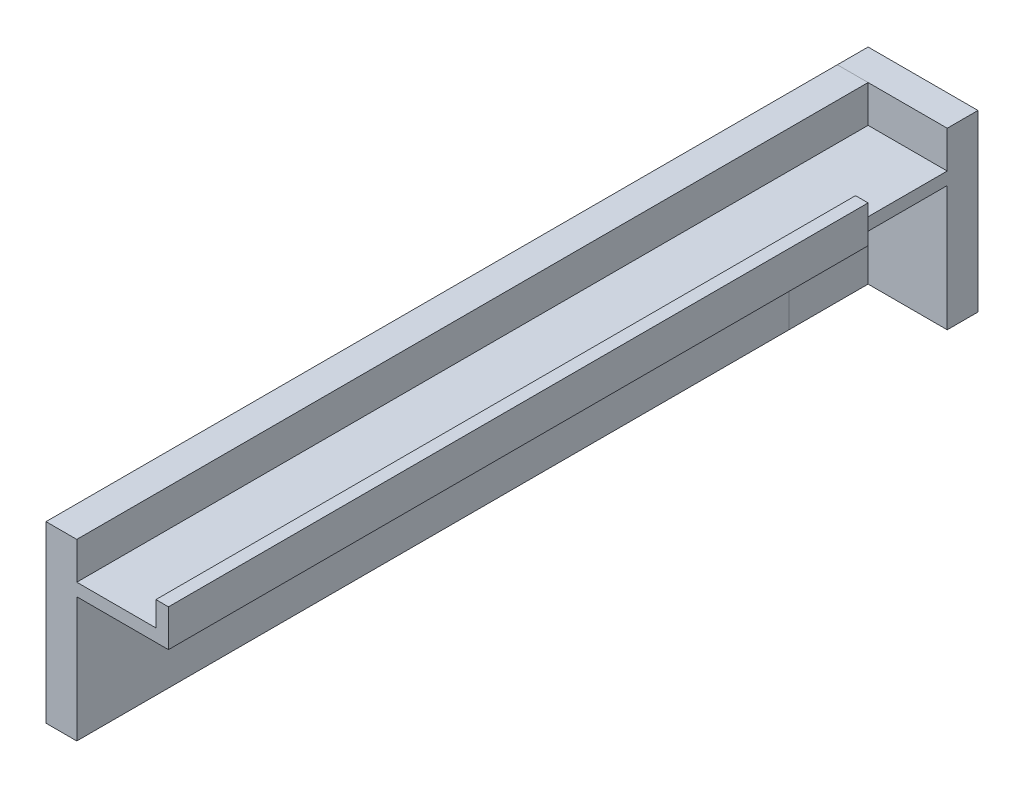
ISO-10303-21;
HEADER;
FILE_DESCRIPTION(('STEP AP214'),'2;1');
FILE_NAME('part.step','',(''),(''),'','','');
FILE_SCHEMA(('AUTOMOTIVE_DESIGN { 1 0 10303 214 1 1 1 1 }'));
ENDSEC;
DATA;
#1=APPLICATION_CONTEXT('core data for automotive mechanical design processes');
#2=APPLICATION_PROTOCOL_DEFINITION('international standard','automotive_design',2000,#1);
#3=PRODUCT_CONTEXT('',#1,'mechanical');
#4=PRODUCT('Part','Part','',(#3));
#5=PRODUCT_RELATED_PRODUCT_CATEGORY('part','',(#4));
#6=PRODUCT_DEFINITION_FORMATION('','',#4);
#7=PRODUCT_DEFINITION_CONTEXT('part definition',#1,'design');
#8=PRODUCT_DEFINITION('design','',#6,#7);
#9=PRODUCT_DEFINITION_SHAPE('','',#8);
#10=(LENGTH_UNIT() NAMED_UNIT(*) SI_UNIT(.MILLI.,.METRE.));
#11=(NAMED_UNIT(*) PLANE_ANGLE_UNIT() SI_UNIT($,.RADIAN.));
#12=(NAMED_UNIT(*) SI_UNIT($,.STERADIAN.) SOLID_ANGLE_UNIT());
#13=UNCERTAINTY_MEASURE_WITH_UNIT(LENGTH_MEASURE(1.E-05),#10,'distance_accuracy_value','');
#14=(GEOMETRIC_REPRESENTATION_CONTEXT(3) GLOBAL_UNCERTAINTY_ASSIGNED_CONTEXT((#13)) GLOBAL_UNIT_ASSIGNED_CONTEXT((#10,
#11,#12)) REPRESENTATION_CONTEXT('',''));
#15=CARTESIAN_POINT('',(0.,0.,0.));
#16=DIRECTION('',(0.,0.,1.));
#17=DIRECTION('',(1.,0.,0.));
#18=AXIS2_PLACEMENT_3D('',#15,#16,#17);
#19=CARTESIAN_POINT('',(0.,0.,0.));
#20=DIRECTION('',(0.,0.,1.));
#21=DIRECTION('',(1.,0.,0.));
#22=AXIS2_PLACEMENT_3D('',#19,#20,#21);
#23=PLANE('',#22);
#24=DIRECTION('',(0.,1.,0.));
#25=VECTOR('',#24,1.);
#26=CARTESIAN_POINT('',(-31.996,2.89240252735399,0.));
#27=LINE('',#26,#25);
#28=CARTESIAN_POINT('',(-31.996,-2.18759747264602,0.));
#29=VERTEX_POINT('',#28);
#30=CARTESIAN_POINT('',(-31.996,2.89240252735398,0.));
#31=VERTEX_POINT('',#30);
#32=EDGE_CURVE('E186',#29,#31,#27,.T.);
#33=ORIENTED_EDGE('',*,*,#32,.F.);
#34=DIRECTION('',(0.,1.,0.));
#35=VECTOR('',#34,1.);
#36=CARTESIAN_POINT('',(-31.996,-52.7221143473571,0.));
#37=LINE('',#36,#35);
#38=CARTESIAN_POINT('',(-31.996,-52.7221143473571,0.));
#39=VERTEX_POINT('',#38);
#40=EDGE_CURVE('E256',#39,#29,#37,.T.);
#41=ORIENTED_EDGE('',*,*,#40,.F.);
#42=DIRECTION('',(1.,0.,0.));
#43=VECTOR('',#42,1.);
#44=CARTESIAN_POINT('',(-44.446,-52.7221143473571,0.));
#45=LINE('',#44,#43);
#46=CARTESIAN_POINT('',(-32.,-52.7221143473571,0.));
#47=VERTEX_POINT('',#46);
#48=EDGE_CURVE('E232',#47,#39,#45,.T.);
#49=ORIENTED_EDGE('',*,*,#48,.F.);
#50=DIRECTION('',(0.,-1.,0.));
#51=VECTOR('',#50,1.);
#52=CARTESIAN_POINT('',(-32.,17.892402527354,0.));
#53=LINE('',#52,#51);
#54=CARTESIAN_POINT('',(-32.,2.89240252735398,0.));
#55=VERTEX_POINT('',#54);
#56=EDGE_CURVE('E11',#55,#47,#53,.T.);
#57=ORIENTED_EDGE('',*,*,#56,.F.);
#58=DIRECTION('',(-1.,0.,0.));
#59=VECTOR('',#58,1.);
#60=CARTESIAN_POINT('',(0.,2.89240252735399,0.));
#61=LINE('',#60,#59);
#62=EDGE_CURVE('E60',#31,#55,#61,.T.);
#63=ORIENTED_EDGE('',*,*,#62,.F.);
#64=EDGE_LOOP('',(#33,#41,#49,#57,#63));
#65=FACE_BOUND('',#64,.T.);
#66=ADVANCED_FACE('F36',(#65),#23,.F.);
#67=CARTESIAN_POINT('',(-32.,17.892402527354,288.036));
#68=DIRECTION('',(0.,-1.,0.));
#69=DIRECTION('',(1.,0.,0.));
#70=AXIS2_PLACEMENT_3D('',#67,#68,#69);
#71=PLANE('',#70);
#72=DIRECTION('',(0.,0.,-1.));
#73=VECTOR('',#72,1.);
#74=CARTESIAN_POINT('',(-32.,17.892402527354,288.036));
#75=LINE('',#74,#73);
#76=CARTESIAN_POINT('',(-32.,17.892402527354,288.036));
#77=VERTEX_POINT('',#76);
#78=CARTESIAN_POINT('',(-32.,17.892402527354,-32.));
#79=VERTEX_POINT('',#78);
#80=EDGE_CURVE('E254',#77,#79,#75,.T.);
#81=ORIENTED_EDGE('',*,*,#80,.T.);
#82=DIRECTION('',(1.,0.,0.));
#83=VECTOR('',#82,1.);
#84=CARTESIAN_POINT('',(-32.,17.892402527354,-32.));
#85=LINE('',#84,#83);
#86=CARTESIAN_POINT('',(-44.446,17.892402527354,-32.));
#87=VERTEX_POINT('',#86);
#88=EDGE_CURVE('E210',#87,#79,#85,.T.);
#89=ORIENTED_EDGE('',*,*,#88,.F.);
#90=DIRECTION('',(0.,0.,-1.));
#91=VECTOR('',#90,1.);
#92=CARTESIAN_POINT('',(-44.446,17.892402527354,288.036));
#93=LINE('',#92,#91);
#94=CARTESIAN_POINT('',(-44.446,17.892402527354,288.036));
#95=VERTEX_POINT('',#94);
#96=EDGE_CURVE('E40',#95,#87,#93,.T.);
#97=ORIENTED_EDGE('',*,*,#96,.F.);
#98=DIRECTION('',(-1.,0.,0.));
#99=VECTOR('',#98,1.);
#100=CARTESIAN_POINT('',(-32.,17.892402527354,288.036));
#101=LINE('',#100,#99);
#102=EDGE_CURVE('E233',#77,#95,#101,.T.);
#103=ORIENTED_EDGE('',*,*,#102,.F.);
#104=EDGE_LOOP('',(#81,#89,#97,#103));
#105=FACE_BOUND('',#104,.T.);
#106=ADVANCED_FACE('F38',(#105),#71,.F.);
#107=CARTESIAN_POINT('',(-44.446,17.892402527354,288.036));
#108=DIRECTION('',(1.,0.,0.));
#109=DIRECTION('',(0.,0.,-1.));
#110=AXIS2_PLACEMENT_3D('',#107,#108,#109);
#111=PLANE('',#110);
#112=ORIENTED_EDGE('',*,*,#96,.T.);
#113=DIRECTION('',(0.,1.,0.));
#114=VECTOR('',#113,1.);
#115=CARTESIAN_POINT('',(-44.446,17.892402527354,-32.));
#116=LINE('',#115,#114);
#117=CARTESIAN_POINT('',(-44.446,17.8878856526429,-32.));
#118=VERTEX_POINT('',#117);
#119=EDGE_CURVE('E182',#118,#87,#116,.T.);
#120=ORIENTED_EDGE('',*,*,#119,.F.);
#121=DIRECTION('',(0.,0.,1.));
#122=VECTOR('',#121,1.);
#123=CARTESIAN_POINT('',(-44.446,17.8878856526429,-44.45));
#124=LINE('',#123,#122);
#125=CARTESIAN_POINT('',(-44.446,17.8878856526429,-44.45));
#126=VERTEX_POINT('',#125);
#127=EDGE_CURVE('E163',#126,#118,#124,.T.);
#128=ORIENTED_EDGE('',*,*,#127,.F.);
#129=DIRECTION('',(0.,1.,0.));
#130=VECTOR('',#129,1.);
#131=CARTESIAN_POINT('',(-44.446,-52.7221143473571,-44.45));
#132=LINE('',#131,#130);
#133=CARTESIAN_POINT('',(-44.446,-52.7221143473571,-44.45));
#134=VERTEX_POINT('',#133);
#135=EDGE_CURVE('E169',#134,#126,#132,.T.);
#136=ORIENTED_EDGE('',*,*,#135,.F.);
#137=DIRECTION('',(0.,0.,-1.));
#138=VECTOR('',#137,1.);
#139=CARTESIAN_POINT('',(-44.446,-52.7221143473571,288.036));
#140=LINE('',#139,#138);
#141=CARTESIAN_POINT('',(-44.446,-52.7221143473571,288.036));
#142=VERTEX_POINT('',#141);
#143=EDGE_CURVE('E281',#142,#134,#140,.T.);
#144=ORIENTED_EDGE('',*,*,#143,.F.);
#145=DIRECTION('',(0.,-1.,0.));
#146=VECTOR('',#145,1.);
#147=CARTESIAN_POINT('',(-44.446,17.892402527354,288.036));
#148=LINE('',#147,#146);
#149=EDGE_CURVE('E236',#95,#142,#148,.T.);
#150=ORIENTED_EDGE('',*,*,#149,.F.);
#151=EDGE_LOOP('',(#112,#120,#128,#136,#144,#150));
#152=FACE_BOUND('',#151,.T.);
#153=ADVANCED_FACE('F181',(#152),#111,.F.);
#154=CARTESIAN_POINT('',(-44.446,-52.7221143473571,288.036));
#155=DIRECTION('',(0.,1.,0.));
#156=DIRECTION('',(-1.,0.,0.));
#157=AXIS2_PLACEMENT_3D('',#154,#155,#156);
#158=PLANE('',#157);
#159=ORIENTED_EDGE('',*,*,#143,.T.);
#160=DIRECTION('',(-1.,0.,0.));
#161=VECTOR('',#160,1.);
#162=CARTESIAN_POINT('',(-44.446,-52.7221143473571,-44.45));
#163=LINE('',#162,#161);
#164=CARTESIAN_POINT('',(0.,-52.7221143473571,-44.45));
#165=VERTEX_POINT('',#164);
#166=EDGE_CURVE('E175',#165,#134,#163,.T.);
#167=ORIENTED_EDGE('',*,*,#166,.F.);
#168=DIRECTION('',(0.,0.,1.));
#169=VECTOR('',#168,1.);
#170=CARTESIAN_POINT('',(0.,-52.7221143473571,-44.45));
#171=LINE('',#170,#169);
#172=CARTESIAN_POINT('',(0.,-52.7221143473571,-32.));
#173=VERTEX_POINT('',#172);
#174=EDGE_CURVE('E189',#165,#173,#171,.T.);
#175=ORIENTED_EDGE('',*,*,#174,.T.);
#176=DIRECTION('',(-1.,0.,0.));
#177=VECTOR('',#176,1.);
#178=CARTESIAN_POINT('',(-44.446,-52.7221143473571,-32.));
#179=LINE('',#178,#177);
#180=CARTESIAN_POINT('',(-32.,-52.7221143473571,-32.));
#181=VERTEX_POINT('',#180);
#182=EDGE_CURVE('E178',#173,#181,#179,.T.);
#183=ORIENTED_EDGE('',*,*,#182,.T.);
#184=DIRECTION('',(0.,0.,1.));
#185=VECTOR('',#184,1.);
#186=CARTESIAN_POINT('',(-32.,-52.7221143473571,-32.));
#187=LINE('',#186,#185);
#188=EDGE_CURVE('E212',#181,#47,#187,.T.);
#189=ORIENTED_EDGE('',*,*,#188,.T.);
#190=ORIENTED_EDGE('',*,*,#48,.T.);
#191=DIRECTION('',(0.,0.,-1.));
#192=VECTOR('',#191,1.);
#193=CARTESIAN_POINT('',(-31.996,-52.7221143473571,288.036));
#194=LINE('',#193,#192);
#195=CARTESIAN_POINT('',(-31.996,-52.7221143473571,288.036));
#196=VERTEX_POINT('',#195);
#197=EDGE_CURVE('E279',#196,#39,#194,.T.);
#198=ORIENTED_EDGE('',*,*,#197,.F.);
#199=DIRECTION('',(1.,0.,0.));
#200=VECTOR('',#199,1.);
#201=CARTESIAN_POINT('',(-44.446,-52.7221143473571,288.036));
#202=LINE('',#201,#200);
#203=EDGE_CURVE('E238',#142,#196,#202,.T.);
#204=ORIENTED_EDGE('',*,*,#203,.F.);
#205=EDGE_LOOP('',(#159,#167,#175,#183,#189,#190,#198,#204));
#206=FACE_BOUND('',#205,.T.);
#207=ADVANCED_FACE('F315',(#206),#158,.F.);
#208=CARTESIAN_POINT('',(-31.996,-52.7221143473571,288.036));
#209=DIRECTION('',(-1.,0.,0.));
#210=DIRECTION('',(0.,-1.,0.));
#211=AXIS2_PLACEMENT_3D('',#208,#209,#210);
#212=PLANE('',#211);
#213=ORIENTED_EDGE('',*,*,#40,.T.);
#214=DIRECTION('',(0.,0.,-1.));
#215=VECTOR('',#214,1.);
#216=CARTESIAN_POINT('',(-31.996,-2.18759747264602,288.036));
#217=LINE('',#216,#215);
#218=CARTESIAN_POINT('',(-31.996,-2.18759747264602,288.036));
#219=VERTEX_POINT('',#218);
#220=EDGE_CURVE('E276',#219,#29,#217,.T.);
#221=ORIENTED_EDGE('',*,*,#220,.F.);
#222=DIRECTION('',(0.,1.,0.));
#223=VECTOR('',#222,1.);
#224=CARTESIAN_POINT('',(-31.996,-52.7221143473571,288.036));
#225=LINE('',#224,#223);
#226=EDGE_CURVE('E240',#196,#219,#225,.T.);
#227=ORIENTED_EDGE('',*,*,#226,.F.);
#228=ORIENTED_EDGE('',*,*,#197,.T.);
#229=EDGE_LOOP('',(#213,#221,#227,#228));
#230=FACE_BOUND('',#229,.T.);
#231=ADVANCED_FACE('F317',(#230),#212,.F.);
#232=CARTESIAN_POINT('',(-31.996,-2.18759747264602,288.036));
#233=DIRECTION('',(0.,1.,0.));
#234=DIRECTION('',(-1.,0.,0.));
#235=AXIS2_PLACEMENT_3D('',#232,#233,#234);
#236=PLANE('',#235);
#237=ORIENTED_EDGE('',*,*,#220,.T.);
#238=DIRECTION('',(0.,0.,1.));
#239=VECTOR('',#238,1.);
#240=CARTESIAN_POINT('',(-31.996,-2.18759747264602,-32.));
#241=LINE('',#240,#239);
#242=CARTESIAN_POINT('',(-31.996,-2.18759747264602,-32.));
#243=VERTEX_POINT('',#242);
#244=EDGE_CURVE('E206',#243,#29,#241,.T.);
#245=ORIENTED_EDGE('',*,*,#244,.F.);
#246=DIRECTION('',(-1.,0.,0.));
#247=VECTOR('',#246,1.);
#248=CARTESIAN_POINT('',(0.,-2.18759747264602,-32.));
#249=LINE('',#248,#247);
#250=CARTESIAN_POINT('',(0.,-2.18759747264602,-32.));
#251=VERTEX_POINT('',#250);
#252=EDGE_CURVE('E193',#251,#243,#249,.T.);
#253=ORIENTED_EDGE('',*,*,#252,.F.);
#254=DIRECTION('',(0.,0.,1.));
#255=VECTOR('',#254,1.);
#256=CARTESIAN_POINT('',(0.,-2.18759747264602,288.036));
#257=LINE('',#256,#255);
#258=CARTESIAN_POINT('',(0.,-2.18759747264601,5.08));
#259=VERTEX_POINT('',#258);
#260=EDGE_CURVE('E226',#251,#259,#257,.T.);
#261=ORIENTED_EDGE('',*,*,#260,.T.);
#262=DIRECTION('',(1.,0.,0.));
#263=VECTOR('',#262,1.);
#264=CARTESIAN_POINT('',(-31.996,-2.18759747264602,5.07999999999997));
#265=LINE('',#264,#263);
#266=CARTESIAN_POINT('',(5.08,-2.18759747264601,5.08));
#267=VERTEX_POINT('',#266);
#268=EDGE_CURVE('E229',#259,#267,#265,.T.);
#269=ORIENTED_EDGE('',*,*,#268,.T.);
#270=DIRECTION('',(0.,0.,-1.));
#271=VECTOR('',#270,1.);
#272=CARTESIAN_POINT('',(5.08,-2.18759747264602,288.036));
#273=LINE('',#272,#271);
#274=CARTESIAN_POINT('',(5.08,-2.18759747264602,288.036));
#275=VERTEX_POINT('',#274);
#276=EDGE_CURVE('E273',#275,#267,#273,.T.);
#277=ORIENTED_EDGE('',*,*,#276,.F.);
#278=DIRECTION('',(1.,0.,0.));
#279=VECTOR('',#278,1.);
#280=CARTESIAN_POINT('',(-31.996,-2.18759747264602,288.036));
#281=LINE('',#280,#279);
#282=EDGE_CURVE('E242',#219,#275,#281,.T.);
#283=ORIENTED_EDGE('',*,*,#282,.F.);
#284=EDGE_LOOP('',(#237,#245,#253,#261,#269,#277,#283));
#285=FACE_BOUND('',#284,.T.);
#286=ADVANCED_FACE('F323',(#285),#236,.F.);
#287=CARTESIAN_POINT('',(5.08,-2.18759747264602,288.036));
#288=DIRECTION('',(-1.,0.,0.));
#289=DIRECTION('',(0.,-1.,0.));
#290=AXIS2_PLACEMENT_3D('',#287,#288,#289);
#291=PLANE('',#290);
#292=ORIENTED_EDGE('',*,*,#276,.T.);
#293=DIRECTION('',(0.,1.,0.));
#294=VECTOR('',#293,1.);
#295=CARTESIAN_POINT('',(5.08,-52.7221143473571,5.08));
#296=LINE('',#295,#294);
#297=CARTESIAN_POINT('',(5.08,12.812402527354,5.08));
#298=VERTEX_POINT('',#297);
#299=EDGE_CURVE('E219',#267,#298,#296,.T.);
#300=ORIENTED_EDGE('',*,*,#299,.T.);
#301=DIRECTION('',(0.,0.,-1.));
#302=VECTOR('',#301,1.);
#303=CARTESIAN_POINT('',(5.08,12.812402527354,288.036));
#304=LINE('',#303,#302);
#305=CARTESIAN_POINT('',(5.08,12.812402527354,288.036));
#306=VERTEX_POINT('',#305);
#307=EDGE_CURVE('E270',#306,#298,#304,.T.);
#308=ORIENTED_EDGE('',*,*,#307,.F.);
#309=DIRECTION('',(0.,1.,0.));
#310=VECTOR('',#309,1.);
#311=CARTESIAN_POINT('',(5.08,-2.18759747264602,288.036));
#312=LINE('',#311,#310);
#313=EDGE_CURVE('E244',#275,#306,#312,.T.);
#314=ORIENTED_EDGE('',*,*,#313,.F.);
#315=EDGE_LOOP('',(#292,#300,#308,#314));
#316=FACE_BOUND('',#315,.T.);
#317=ADVANCED_FACE('F348',(#316),#291,.F.);
#318=CARTESIAN_POINT('',(5.08,12.812402527354,288.036));
#319=DIRECTION('',(0.,-1.,0.));
#320=DIRECTION('',(1.,0.,0.));
#321=AXIS2_PLACEMENT_3D('',#318,#319,#320);
#322=PLANE('',#321);
#323=ORIENTED_EDGE('',*,*,#307,.T.);
#324=DIRECTION('',(1.,0.,0.));
#325=VECTOR('',#324,1.);
#326=CARTESIAN_POINT('',(0.,12.812402527354,5.08));
#327=LINE('',#326,#325);
#328=CARTESIAN_POINT('',(0.,12.812402527354,5.08));
#329=VERTEX_POINT('',#328);
#330=EDGE_CURVE('E216',#329,#298,#327,.T.);
#331=ORIENTED_EDGE('',*,*,#330,.F.);
#332=DIRECTION('',(0.,0.,-1.));
#333=VECTOR('',#332,1.);
#334=CARTESIAN_POINT('',(0.,12.812402527354,288.036));
#335=LINE('',#334,#333);
#336=CARTESIAN_POINT('',(0.,12.812402527354,288.036));
#337=VERTEX_POINT('',#336);
#338=EDGE_CURVE('E267',#337,#329,#335,.T.);
#339=ORIENTED_EDGE('',*,*,#338,.F.);
#340=DIRECTION('',(-1.,0.,0.));
#341=VECTOR('',#340,1.);
#342=CARTESIAN_POINT('',(5.08,12.812402527354,288.036));
#343=LINE('',#342,#341);
#344=EDGE_CURVE('E246',#306,#337,#343,.T.);
#345=ORIENTED_EDGE('',*,*,#344,.F.);
#346=EDGE_LOOP('',(#323,#331,#339,#345));
#347=FACE_BOUND('',#346,.T.);
#348=ADVANCED_FACE('F344',(#347),#322,.F.);
#349=CARTESIAN_POINT('',(0.,12.812402527354,288.036));
#350=DIRECTION('',(1.,0.,0.));
#351=DIRECTION('',(0.,1.,0.));
#352=AXIS2_PLACEMENT_3D('',#349,#350,#351);
#353=PLANE('',#352);
#354=ORIENTED_EDGE('',*,*,#338,.T.);
#355=DIRECTION('',(0.,1.,0.));
#356=VECTOR('',#355,1.);
#357=CARTESIAN_POINT('',(0.,-52.7221143473571,5.08));
#358=LINE('',#357,#356);
#359=CARTESIAN_POINT('',(0.,2.89240252735399,5.08));
#360=VERTEX_POINT('',#359);
#361=EDGE_CURVE('E218',#360,#329,#358,.T.);
#362=ORIENTED_EDGE('',*,*,#361,.F.);
#363=DIRECTION('',(0.,0.,-1.));
#364=VECTOR('',#363,1.);
#365=CARTESIAN_POINT('',(0.,2.89240252735399,288.036));
#366=LINE('',#365,#364);
#367=CARTESIAN_POINT('',(0.,2.89240252735399,288.036));
#368=VERTEX_POINT('',#367);
#369=EDGE_CURVE('E264',#368,#360,#366,.T.);
#370=ORIENTED_EDGE('',*,*,#369,.F.);
#371=DIRECTION('',(0.,-1.,0.));
#372=VECTOR('',#371,1.);
#373=CARTESIAN_POINT('',(0.,12.812402527354,288.036));
#374=LINE('',#373,#372);
#375=EDGE_CURVE('E248',#337,#368,#374,.T.);
#376=ORIENTED_EDGE('',*,*,#375,.F.);
#377=EDGE_LOOP('',(#354,#362,#370,#376));
#378=FACE_BOUND('',#377,.T.);
#379=ADVANCED_FACE('F340',(#378),#353,.F.);
#380=CARTESIAN_POINT('',(0.,2.89240252735399,288.036));
#381=DIRECTION('',(0.,-1.,0.));
#382=DIRECTION('',(1.,0.,0.));
#383=AXIS2_PLACEMENT_3D('',#380,#381,#382);
#384=PLANE('',#383);
#385=DIRECTION('',(0.,0.,-1.));
#386=VECTOR('',#385,1.);
#387=CARTESIAN_POINT('',(0.,2.89240252735399,288.036));
#388=LINE('',#387,#386);
#389=CARTESIAN_POINT('',(0.,2.89240252735399,-32.));
#390=VERTEX_POINT('',#389);
#391=EDGE_CURVE('E222',#360,#390,#388,.T.);
#392=ORIENTED_EDGE('',*,*,#391,.T.);
#393=DIRECTION('',(1.,0.,0.));
#394=VECTOR('',#393,1.);
#395=CARTESIAN_POINT('',(0.,2.89240252735399,-32.));
#396=LINE('',#395,#394);
#397=CARTESIAN_POINT('',(-31.996,2.89240252735399,-32.));
#398=VERTEX_POINT('',#397);
#399=EDGE_CURVE('E199',#398,#390,#396,.T.);
#400=ORIENTED_EDGE('',*,*,#399,.F.);
#401=DIRECTION('',(0.,0.,1.));
#402=VECTOR('',#401,1.);
#403=CARTESIAN_POINT('',(-31.996,2.89240252735399,-32.));
#404=LINE('',#403,#402);
#405=EDGE_CURVE('E202',#398,#31,#404,.T.);
#406=ORIENTED_EDGE('',*,*,#405,.T.);
#407=ORIENTED_EDGE('',*,*,#62,.T.);
#408=DIRECTION('',(0.,0.,-1.));
#409=VECTOR('',#408,1.);
#410=CARTESIAN_POINT('',(-32.,2.89240252735398,288.036));
#411=LINE('',#410,#409);
#412=CARTESIAN_POINT('',(-32.,2.89240252735398,288.036));
#413=VERTEX_POINT('',#412);
#414=EDGE_CURVE('E261',#413,#55,#411,.T.);
#415=ORIENTED_EDGE('',*,*,#414,.F.);
#416=DIRECTION('',(-1.,0.,0.));
#417=VECTOR('',#416,1.);
#418=CARTESIAN_POINT('',(0.,2.89240252735399,288.036));
#419=LINE('',#418,#417);
#420=EDGE_CURVE('E250',#368,#413,#419,.T.);
#421=ORIENTED_EDGE('',*,*,#420,.F.);
#422=ORIENTED_EDGE('',*,*,#369,.T.);
#423=EDGE_LOOP('',(#392,#400,#406,#407,#415,#421,#422));
#424=FACE_BOUND('',#423,.T.);
#425=ADVANCED_FACE('F337',(#424),#384,.F.);
#426=CARTESIAN_POINT('',(-32.,2.89240252735398,288.036));
#427=DIRECTION('',(-1.,0.,0.));
#428=DIRECTION('',(0.,0.,1.));
#429=AXIS2_PLACEMENT_3D('',#426,#427,#428);
#430=PLANE('',#429);
#431=ORIENTED_EDGE('',*,*,#414,.T.);
#432=ORIENTED_EDGE('',*,*,#56,.T.);
#433=ORIENTED_EDGE('',*,*,#188,.F.);
#434=DIRECTION('',(0.,-1.,0.));
#435=VECTOR('',#434,1.);
#436=CARTESIAN_POINT('',(-32.,17.892402527354,-32.));
#437=LINE('',#436,#435);
#438=CARTESIAN_POINT('',(-32.,17.8878856526429,-32.));
#439=VERTEX_POINT('',#438);
#440=EDGE_CURVE('E183',#439,#181,#437,.T.);
#441=ORIENTED_EDGE('',*,*,#440,.F.);
#442=EDGE_CURVE('E188',#79,#439,#437,.T.);
#443=ORIENTED_EDGE('',*,*,#442,.F.);
#444=ORIENTED_EDGE('',*,*,#80,.F.);
#445=DIRECTION('',(0.,1.,0.));
#446=VECTOR('',#445,1.);
#447=CARTESIAN_POINT('',(-32.,2.89240252735398,288.036));
#448=LINE('',#447,#446);
#449=EDGE_CURVE('E252',#413,#77,#448,.T.);
#450=ORIENTED_EDGE('',*,*,#449,.F.);
#451=EDGE_LOOP('',(#431,#432,#433,#441,#443,#444,#450));
#452=FACE_BOUND('',#451,.T.);
#453=ADVANCED_FACE('F293',(#452),#430,.F.);
#454=CARTESIAN_POINT('',(0.,0.,288.036));
#455=DIRECTION('',(0.,0.,1.));
#456=DIRECTION('',(1.,0.,0.));
#457=AXIS2_PLACEMENT_3D('',#454,#455,#456);
#458=PLANE('',#457);
#459=ORIENTED_EDGE('',*,*,#102,.T.);
#460=ORIENTED_EDGE('',*,*,#149,.T.);
#461=ORIENTED_EDGE('',*,*,#203,.T.);
#462=ORIENTED_EDGE('',*,*,#226,.T.);
#463=ORIENTED_EDGE('',*,*,#282,.T.);
#464=ORIENTED_EDGE('',*,*,#313,.T.);
#465=ORIENTED_EDGE('',*,*,#344,.T.);
#466=ORIENTED_EDGE('',*,*,#375,.T.);
#467=ORIENTED_EDGE('',*,*,#420,.T.);
#468=ORIENTED_EDGE('',*,*,#449,.T.);
#469=EDGE_LOOP('',(#459,#460,#461,#462,#463,#464,#465,#466,#467,#468));
#470=FACE_BOUND('',#469,.T.);
#471=ADVANCED_FACE('F333',(#470),#458,.T.);
#472=CARTESIAN_POINT('',(0.,-52.7221143473571,5.08));
#473=DIRECTION('',(0.,0.,1.));
#474=DIRECTION('',(1.,0.,0.));
#475=AXIS2_PLACEMENT_3D('',#472,#473,#474);
#476=PLANE('',#475);
#477=EDGE_CURVE('E223',#259,#360,#358,.T.);
#478=ORIENTED_EDGE('',*,*,#477,.T.);
#479=ORIENTED_EDGE('',*,*,#361,.T.);
#480=ORIENTED_EDGE('',*,*,#330,.T.);
#481=ORIENTED_EDGE('',*,*,#299,.F.);
#482=ORIENTED_EDGE('',*,*,#268,.F.);
#483=EDGE_LOOP('',(#478,#479,#480,#481,#482));
#484=FACE_BOUND('',#483,.T.);
#485=ADVANCED_FACE('F370',(#484),#476,.F.);
#486=CARTESIAN_POINT('',(0.,-52.7221143473571,0.));
#487=DIRECTION('',(-1.,0.,0.));
#488=DIRECTION('',(0.,0.,1.));
#489=AXIS2_PLACEMENT_3D('',#486,#487,#488);
#490=PLANE('',#489);
#491=ORIENTED_EDGE('',*,*,#260,.F.);
#492=DIRECTION('',(0.,-1.,0.));
#493=VECTOR('',#492,1.);
#494=CARTESIAN_POINT('',(0.,-52.7221143473571,-32.));
#495=LINE('',#494,#493);
#496=EDGE_CURVE('E305',#251,#173,#495,.T.);
#497=ORIENTED_EDGE('',*,*,#496,.T.);
#498=ORIENTED_EDGE('',*,*,#174,.F.);
#499=DIRECTION('',(0.,-1.,0.));
#500=VECTOR('',#499,1.);
#501=CARTESIAN_POINT('',(0.,-52.7221143473571,-44.45));
#502=LINE('',#501,#500);
#503=CARTESIAN_POINT('',(0.,17.8878856526429,-44.45));
#504=VERTEX_POINT('',#503);
#505=EDGE_CURVE('E168',#504,#165,#502,.T.);
#506=ORIENTED_EDGE('',*,*,#505,.F.);
#507=DIRECTION('',(0.,0.,1.));
#508=VECTOR('',#507,1.);
#509=CARTESIAN_POINT('',(0.,17.8878856526429,-44.45));
#510=LINE('',#509,#508);
#511=CARTESIAN_POINT('',(0.,17.8878856526429,-32.));
#512=VERTEX_POINT('',#511);
#513=EDGE_CURVE('E165',#504,#512,#510,.T.);
#514=ORIENTED_EDGE('',*,*,#513,.T.);
#515=EDGE_CURVE('E303',#512,#390,#495,.T.);
#516=ORIENTED_EDGE('',*,*,#515,.T.);
#517=ORIENTED_EDGE('',*,*,#391,.F.);
#518=ORIENTED_EDGE('',*,*,#477,.F.);
#519=EDGE_LOOP('',(#491,#497,#498,#506,#514,#516,#517,#518));
#520=FACE_BOUND('',#519,.T.);
#521=ADVANCED_FACE('F313',(#520),#490,.F.);
#522=CARTESIAN_POINT('',(0.,0.,-32.));
#523=DIRECTION('',(0.,0.,-1.));
#524=DIRECTION('',(-1.,0.,0.));
#525=AXIS2_PLACEMENT_3D('',#522,#523,#524);
#526=PLANE('',#525);
#527=DIRECTION('',(1.,0.,0.));
#528=VECTOR('',#527,1.);
#529=CARTESIAN_POINT('',(-44.446,17.8878856526429,-32.));
#530=LINE('',#529,#528);
#531=EDGE_CURVE('E52',#118,#439,#530,.T.);
#532=ORIENTED_EDGE('',*,*,#531,.F.);
#533=ORIENTED_EDGE('',*,*,#119,.T.);
#534=ORIENTED_EDGE('',*,*,#88,.T.);
#535=ORIENTED_EDGE('',*,*,#442,.T.);
#536=EDGE_LOOP('',(#532,#533,#534,#535));
#537=FACE_BOUND('',#536,.T.);
#538=ADVANCED_FACE('F290',(#537),#526,.T.);
#539=CARTESIAN_POINT('',(-31.996,2.89240252735399,-32.));
#540=DIRECTION('',(1.,0.,0.));
#541=DIRECTION('',(0.,0.,-1.));
#542=AXIS2_PLACEMENT_3D('',#539,#540,#541);
#543=PLANE('',#542);
#544=ORIENTED_EDGE('',*,*,#32,.T.);
#545=ORIENTED_EDGE('',*,*,#405,.F.);
#546=DIRECTION('',(0.,1.,0.));
#547=VECTOR('',#546,1.);
#548=CARTESIAN_POINT('',(-31.996,2.89240252735399,-32.));
#549=LINE('',#548,#547);
#550=EDGE_CURVE('E196',#243,#398,#549,.T.);
#551=ORIENTED_EDGE('',*,*,#550,.F.);
#552=ORIENTED_EDGE('',*,*,#244,.T.);
#553=EDGE_LOOP('',(#544,#545,#551,#552));
#554=FACE_BOUND('',#553,.T.);
#555=ADVANCED_FACE('F364',(#554),#543,.F.);
#556=CARTESIAN_POINT('',(0.,0.,-32.));
#557=DIRECTION('',(0.,0.,-1.));
#558=DIRECTION('',(-1.,0.,0.));
#559=AXIS2_PLACEMENT_3D('',#556,#557,#558);
#560=PLANE('',#559);
#561=EDGE_CURVE('E300',#439,#512,#530,.T.);
#562=ORIENTED_EDGE('',*,*,#561,.F.);
#563=ORIENTED_EDGE('',*,*,#440,.T.);
#564=ORIENTED_EDGE('',*,*,#182,.F.);
#565=ORIENTED_EDGE('',*,*,#496,.F.);
#566=ORIENTED_EDGE('',*,*,#252,.T.);
#567=ORIENTED_EDGE('',*,*,#550,.T.);
#568=ORIENTED_EDGE('',*,*,#399,.T.);
#569=ORIENTED_EDGE('',*,*,#515,.F.);
#570=EDGE_LOOP('',(#562,#563,#564,#565,#566,#567,#568,#569));
#571=FACE_BOUND('',#570,.T.);
#572=ADVANCED_FACE('F301',(#571),#560,.F.);
#573=CARTESIAN_POINT('',(-44.446,17.8878856526429,-44.45));
#574=DIRECTION('',(0.,-1.,0.));
#575=DIRECTION('',(1.,0.,0.));
#576=AXIS2_PLACEMENT_3D('',#573,#574,#575);
#577=PLANE('',#576);
#578=ORIENTED_EDGE('',*,*,#531,.T.);
#579=ORIENTED_EDGE('',*,*,#561,.T.);
#580=ORIENTED_EDGE('',*,*,#513,.F.);
#581=DIRECTION('',(1.,0.,0.));
#582=VECTOR('',#581,1.);
#583=CARTESIAN_POINT('',(-44.446,17.8878856526429,-44.45));
#584=LINE('',#583,#582);
#585=EDGE_CURVE('E159',#126,#504,#584,.T.);
#586=ORIENTED_EDGE('',*,*,#585,.F.);
#587=ORIENTED_EDGE('',*,*,#127,.T.);
#588=EDGE_LOOP('',(#578,#579,#580,#586,#587));
#589=FACE_BOUND('',#588,.T.);
#590=ADVANCED_FACE('F161',(#589),#577,.F.);
#591=CARTESIAN_POINT('',(0.,0.,-44.45));
#592=DIRECTION('',(0.,0.,-1.));
#593=DIRECTION('',(-1.,0.,0.));
#594=AXIS2_PLACEMENT_3D('',#591,#592,#593);
#595=PLANE('',#594);
#596=ORIENTED_EDGE('',*,*,#135,.T.);
#597=ORIENTED_EDGE('',*,*,#585,.T.);
#598=ORIENTED_EDGE('',*,*,#505,.T.);
#599=ORIENTED_EDGE('',*,*,#166,.T.);
#600=EDGE_LOOP('',(#596,#597,#598,#599));
#601=FACE_BOUND('',#600,.T.);
#602=ADVANCED_FACE('F173',(#601),#595,.T.);
#603=CLOSED_SHELL('',(#66,#106,#153,#207,#231,#286,#317,#348,#379,#425,#453,#471,#485,#521,#538,
#555,#572,#590,#602));
#604=MANIFOLD_SOLID_BREP('B2',#603);
#605=ADVANCED_BREP_SHAPE_REPRESENTATION('',(#18,#604),#14);
#606=SHAPE_DEFINITION_REPRESENTATION(#9,#605);
ENDSEC;
END-ISO-10303-21;
